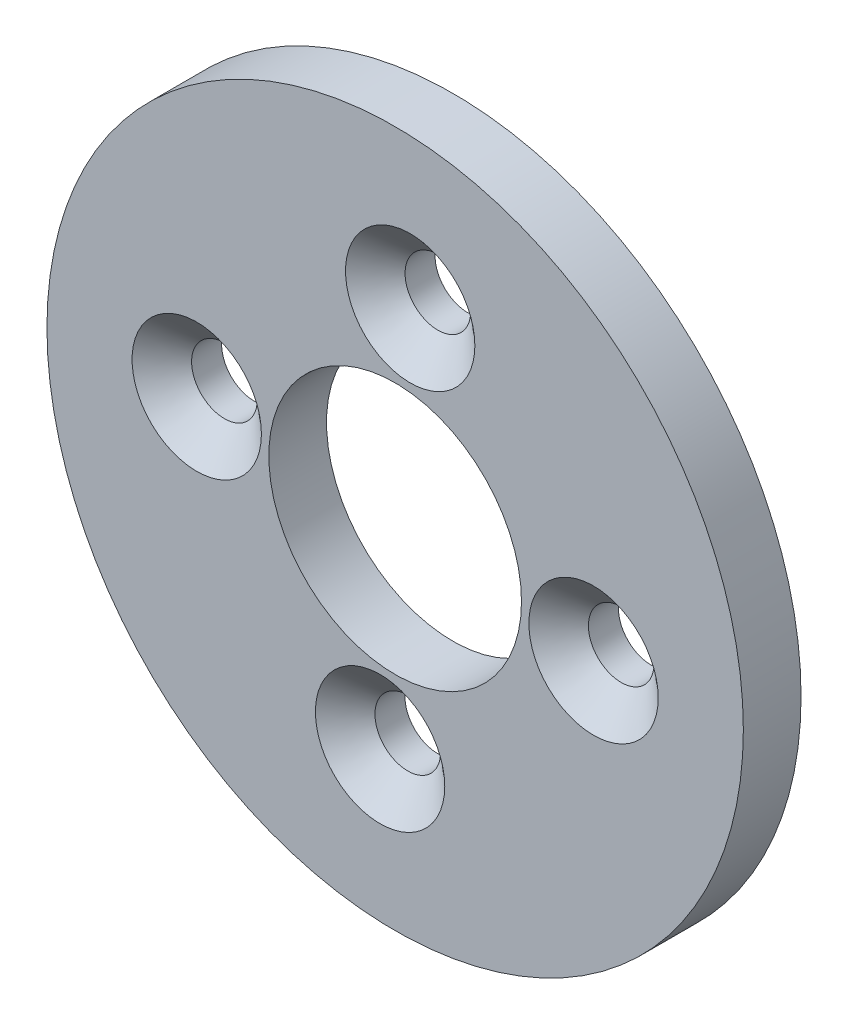
ISO-10303-21;
HEADER;
FILE_DESCRIPTION(('STEP AP214'),'2;1');
FILE_NAME('part.step','',(''),(''),'','','');
FILE_SCHEMA(('AUTOMOTIVE_DESIGN { 1 0 10303 214 1 1 1 1 }'));
ENDSEC;
DATA;
#1=APPLICATION_CONTEXT('core data for automotive mechanical design processes');
#2=APPLICATION_PROTOCOL_DEFINITION('international standard','automotive_design',2000,#1);
#3=PRODUCT_CONTEXT('',#1,'mechanical');
#4=PRODUCT('Part','Part','',(#3));
#5=PRODUCT_RELATED_PRODUCT_CATEGORY('part','',(#4));
#6=PRODUCT_DEFINITION_FORMATION('','',#4);
#7=PRODUCT_DEFINITION_CONTEXT('part definition',#1,'design');
#8=PRODUCT_DEFINITION('design','',#6,#7);
#9=PRODUCT_DEFINITION_SHAPE('','',#8);
#10=(LENGTH_UNIT() NAMED_UNIT(*) SI_UNIT(.MILLI.,.METRE.));
#11=(NAMED_UNIT(*) PLANE_ANGLE_UNIT() SI_UNIT($,.RADIAN.));
#12=(NAMED_UNIT(*) SI_UNIT($,.STERADIAN.) SOLID_ANGLE_UNIT());
#13=UNCERTAINTY_MEASURE_WITH_UNIT(LENGTH_MEASURE(1.E-05),#10,'distance_accuracy_value','');
#14=(GEOMETRIC_REPRESENTATION_CONTEXT(3) GLOBAL_UNCERTAINTY_ASSIGNED_CONTEXT((#13)) GLOBAL_UNIT_ASSIGNED_CONTEXT((#10,
#11,#12)) REPRESENTATION_CONTEXT('',''));
#15=CARTESIAN_POINT('',(0.,0.,0.));
#16=DIRECTION('',(0.,0.,1.));
#17=DIRECTION('',(1.,0.,0.));
#18=AXIS2_PLACEMENT_3D('',#15,#16,#17);
#19=CARTESIAN_POINT('',(0.,0.,2.9));
#20=DIRECTION('',(0.,0.,-1.));
#21=DIRECTION('',(-1.,0.,0.));
#22=AXIS2_PLACEMENT_3D('',#19,#20,#21);
#23=CYLINDRICAL_SURFACE('',#22,17.5);
#24=CARTESIAN_POINT('',(0.,0.,2.9));
#25=DIRECTION('',(0.,0.,1.));
#26=DIRECTION('',(1.,0.,0.));
#27=AXIS2_PLACEMENT_3D('',#24,#25,#26);
#28=CIRCLE('',#27,17.5);
#29=CARTESIAN_POINT('',(17.5,0.,2.9));
#30=VERTEX_POINT('',#29);
#31=EDGE_CURVE('E63',#30,#30,#28,.T.);
#32=ORIENTED_EDGE('',*,*,#31,.F.);
#33=EDGE_LOOP('',(#32));
#34=FACE_BOUND('',#33,.T.);
#35=CARTESIAN_POINT('',(0.,0.,0.));
#36=DIRECTION('',(0.,0.,1.));
#37=DIRECTION('',(1.,0.,0.));
#38=AXIS2_PLACEMENT_3D('',#35,#36,#37);
#39=CIRCLE('',#38,17.5);
#40=CARTESIAN_POINT('',(17.5,0.,0.));
#41=VERTEX_POINT('',#40);
#42=EDGE_CURVE('E64',#41,#41,#39,.T.);
#43=ORIENTED_EDGE('',*,*,#42,.T.);
#44=EDGE_LOOP('',(#43));
#45=FACE_BOUND('',#44,.T.);
#46=ADVANCED_FACE('F31',(#34,#45),#23,.T.);
#47=CARTESIAN_POINT('',(0.,0.,2.9));
#48=DIRECTION('',(0.,0.,1.));
#49=DIRECTION('',(1.,0.,0.));
#50=AXIS2_PLACEMENT_3D('',#47,#48,#49);
#51=PLANE('',#50);
#52=CARTESIAN_POINT('',(0.,0.,2.9));
#53=DIRECTION('',(0.,0.,1.));
#54=DIRECTION('',(1.,0.,0.));
#55=AXIS2_PLACEMENT_3D('',#52,#53,#54);
#56=CIRCLE('',#55,6.35000000000001);
#57=CARTESIAN_POINT('',(6.35,0.,2.9));
#58=VERTEX_POINT('',#57);
#59=EDGE_CURVE('E82',#58,#58,#56,.T.);
#60=ORIENTED_EDGE('',*,*,#59,.F.);
#61=EDGE_LOOP('',(#60));
#62=FACE_BOUND('',#61,.T.);
#63=CARTESIAN_POINT('',(-0.756588791368908,-9.97133759336104,2.9));
#64=DIRECTION('',(0.,0.,1.));
#65=DIRECTION('',(1.,0.,0.));
#66=AXIS2_PLACEMENT_3D('',#63,#64,#65);
#67=CIRCLE('',#66,3.25000000000009);
#68=CARTESIAN_POINT('',(2.49341120863118,-9.97133759336104,2.9));
#69=VERTEX_POINT('',#68);
#70=EDGE_CURVE('E46',#69,#69,#67,.F.);
#71=ORIENTED_EDGE('',*,*,#70,.T.);
#72=EDGE_LOOP('',(#71));
#73=FACE_BOUND('',#72,.T.);
#74=CARTESIAN_POINT('',(-9.97133759336103,0.75658879136889,2.9));
#75=DIRECTION('',(0.,0.,1.));
#76=DIRECTION('',(1.,0.,0.));
#77=AXIS2_PLACEMENT_3D('',#74,#75,#76);
#78=CIRCLE('',#77,3.2500000000001);
#79=CARTESIAN_POINT('',(-6.72133759336093,0.75658879136889,2.9));
#80=VERTEX_POINT('',#79);
#81=EDGE_CURVE('E51',#80,#80,#78,.F.);
#82=ORIENTED_EDGE('',*,*,#81,.T.);
#83=EDGE_LOOP('',(#82));
#84=FACE_BOUND('',#83,.T.);
#85=CARTESIAN_POINT('',(0.756588791368902,9.97133759336102,2.9));
#86=DIRECTION('',(0.,0.,1.));
#87=DIRECTION('',(1.,0.,0.));
#88=AXIS2_PLACEMENT_3D('',#85,#86,#87);
#89=CIRCLE('',#88,3.2500000000001);
#90=CARTESIAN_POINT('',(4.006588791369,9.97133759336102,2.9));
#91=VERTEX_POINT('',#90);
#92=EDGE_CURVE('E54',#91,#91,#89,.F.);
#93=ORIENTED_EDGE('',*,*,#92,.T.);
#94=EDGE_LOOP('',(#93));
#95=FACE_BOUND('',#94,.T.);
#96=CARTESIAN_POINT('',(9.97133759336103,-0.756588791368919,2.9));
#97=DIRECTION('',(0.,0.,1.));
#98=DIRECTION('',(1.,0.,0.));
#99=AXIS2_PLACEMENT_3D('',#96,#97,#98);
#100=CIRCLE('',#99,3.2500000000001);
#101=CARTESIAN_POINT('',(13.2213375933611,-0.756588791368919,2.9));
#102=VERTEX_POINT('',#101);
#103=EDGE_CURVE('E57',#102,#102,#100,.F.);
#104=ORIENTED_EDGE('',*,*,#103,.T.);
#105=EDGE_LOOP('',(#104));
#106=FACE_BOUND('',#105,.T.);
#107=ORIENTED_EDGE('',*,*,#31,.T.);
#108=EDGE_LOOP('',(#107));
#109=FACE_BOUND('',#108,.T.);
#110=ADVANCED_FACE('F97',(#62,#73,#84,#95,#106,#109),#51,.T.);
#111=CARTESIAN_POINT('',(0.,0.,0.));
#112=DIRECTION('',(0.,0.,1.));
#113=DIRECTION('',(1.,0.,0.));
#114=AXIS2_PLACEMENT_3D('',#111,#112,#113);
#115=PLANE('',#114);
#116=CARTESIAN_POINT('',(0.,0.,0.));
#117=DIRECTION('',(0.,0.,1.));
#118=DIRECTION('',(1.,0.,0.));
#119=AXIS2_PLACEMENT_3D('',#116,#117,#118);
#120=CIRCLE('',#119,6.35000000000001);
#121=CARTESIAN_POINT('',(6.35,0.,0.));
#122=VERTEX_POINT('',#121);
#123=EDGE_CURVE('E77',#122,#122,#120,.T.);
#124=ORIENTED_EDGE('',*,*,#123,.T.);
#125=EDGE_LOOP('',(#124));
#126=FACE_BOUND('',#125,.T.);
#127=CARTESIAN_POINT('',(-0.756588791368908,-9.97133759336104,0.));
#128=DIRECTION('',(0.,0.,1.));
#129=DIRECTION('',(1.,0.,0.));
#130=AXIS2_PLACEMENT_3D('',#127,#128,#129);
#131=CIRCLE('',#130,1.65000000000009);
#132=CARTESIAN_POINT('',(0.89341120863118,-9.97133759336104,0.));
#133=VERTEX_POINT('',#132);
#134=EDGE_CURVE('E72',#133,#133,#131,.T.);
#135=ORIENTED_EDGE('',*,*,#134,.T.);
#136=EDGE_LOOP('',(#135));
#137=FACE_BOUND('',#136,.T.);
#138=CARTESIAN_POINT('',(9.97133759336103,-0.756588791368919,0.));
#139=DIRECTION('',(0.,0.,1.));
#140=DIRECTION('',(1.,0.,0.));
#141=AXIS2_PLACEMENT_3D('',#138,#139,#140);
#142=CIRCLE('',#141,1.65000000000009);
#143=CARTESIAN_POINT('',(11.6213375933611,-0.756588791368919,0.));
#144=VERTEX_POINT('',#143);
#145=EDGE_CURVE('E76',#144,#144,#142,.T.);
#146=ORIENTED_EDGE('',*,*,#145,.T.);
#147=EDGE_LOOP('',(#146));
#148=FACE_BOUND('',#147,.T.);
#149=CARTESIAN_POINT('',(0.756588791368902,9.97133759336102,0.));
#150=DIRECTION('',(0.,0.,1.));
#151=DIRECTION('',(1.,0.,0.));
#152=AXIS2_PLACEMENT_3D('',#149,#150,#151);
#153=CIRCLE('',#152,1.65000000000009);
#154=CARTESIAN_POINT('',(2.40658879136899,9.97133759336102,0.));
#155=VERTEX_POINT('',#154);
#156=EDGE_CURVE('E73',#155,#155,#153,.T.);
#157=ORIENTED_EDGE('',*,*,#156,.T.);
#158=EDGE_LOOP('',(#157));
#159=FACE_BOUND('',#158,.T.);
#160=CARTESIAN_POINT('',(-9.97133759336103,0.75658879136889,0.));
#161=DIRECTION('',(0.,0.,1.));
#162=DIRECTION('',(1.,0.,0.));
#163=AXIS2_PLACEMENT_3D('',#160,#161,#162);
#164=CIRCLE('',#163,1.65000000000009);
#165=CARTESIAN_POINT('',(-8.32133759336095,0.75658879136889,0.));
#166=VERTEX_POINT('',#165);
#167=EDGE_CURVE('E67',#166,#166,#164,.T.);
#168=ORIENTED_EDGE('',*,*,#167,.T.);
#169=EDGE_LOOP('',(#168));
#170=FACE_BOUND('',#169,.T.);
#171=ORIENTED_EDGE('',*,*,#42,.F.);
#172=EDGE_LOOP('',(#171));
#173=FACE_BOUND('',#172,.T.);
#174=ADVANCED_FACE('F88',(#126,#137,#148,#159,#170,#173),#115,.F.);
#175=CARTESIAN_POINT('',(-9.97133759336103,0.75658879136889,0.));
#176=DIRECTION('',(0.,0.,1.));
#177=DIRECTION('',(1.,0.,0.));
#178=AXIS2_PLACEMENT_3D('',#175,#176,#177);
#179=CYLINDRICAL_SURFACE('',#178,1.65000000000009);
#180=CARTESIAN_POINT('',(-9.97133759336103,0.75658879136889,1.50914121949403));
#181=DIRECTION('',(0.,0.,1.));
#182=DIRECTION('',(1.,0.,0.));
#183=AXIS2_PLACEMENT_3D('',#180,#181,#182);
#184=CIRCLE('',#183,1.65000000000009);
#185=CARTESIAN_POINT('',(-8.32133759336095,0.75658879136889,1.50914121949403));
#186=VERTEX_POINT('',#185);
#187=EDGE_CURVE('E42',#186,#186,#184,.T.);
#188=ORIENTED_EDGE('',*,*,#187,.T.);
#189=EDGE_LOOP('',(#188));
#190=FACE_BOUND('',#189,.T.);
#191=ORIENTED_EDGE('',*,*,#167,.F.);
#192=EDGE_LOOP('',(#191));
#193=FACE_BOUND('',#192,.T.);
#194=ADVANCED_FACE('F117',(#190,#193),#179,.F.);
#195=CARTESIAN_POINT('',(0.756588791368902,9.97133759336102,0.));
#196=DIRECTION('',(0.,0.,1.));
#197=DIRECTION('',(1.,0.,0.));
#198=AXIS2_PLACEMENT_3D('',#195,#196,#197);
#199=CYLINDRICAL_SURFACE('',#198,1.65000000000009);
#200=CARTESIAN_POINT('',(0.756588791368902,9.97133759336102,1.50914121949403));
#201=DIRECTION('',(0.,0.,1.));
#202=DIRECTION('',(1.,0.,0.));
#203=AXIS2_PLACEMENT_3D('',#200,#201,#202);
#204=CIRCLE('',#203,1.65000000000009);
#205=CARTESIAN_POINT('',(2.40658879136899,9.97133759336102,1.50914121949403));
#206=VERTEX_POINT('',#205);
#207=EDGE_CURVE('E38',#206,#206,#204,.T.);
#208=ORIENTED_EDGE('',*,*,#207,.T.);
#209=EDGE_LOOP('',(#208));
#210=FACE_BOUND('',#209,.T.);
#211=ORIENTED_EDGE('',*,*,#156,.F.);
#212=EDGE_LOOP('',(#211));
#213=FACE_BOUND('',#212,.T.);
#214=ADVANCED_FACE('F122',(#210,#213),#199,.F.);
#215=CARTESIAN_POINT('',(9.97133759336103,-0.756588791368919,0.));
#216=DIRECTION('',(0.,0.,1.));
#217=DIRECTION('',(1.,0.,0.));
#218=AXIS2_PLACEMENT_3D('',#215,#216,#217);
#219=CYLINDRICAL_SURFACE('',#218,1.65000000000009);
#220=CARTESIAN_POINT('',(9.97133759336103,-0.756588791368919,1.50914121949403));
#221=DIRECTION('',(0.,0.,1.));
#222=DIRECTION('',(1.,0.,0.));
#223=AXIS2_PLACEMENT_3D('',#220,#221,#222);
#224=CIRCLE('',#223,1.65000000000009);
#225=CARTESIAN_POINT('',(11.6213375933611,-0.756588791368919,1.50914121949403));
#226=VERTEX_POINT('',#225);
#227=EDGE_CURVE('E10',#226,#226,#224,.T.);
#228=ORIENTED_EDGE('',*,*,#227,.T.);
#229=EDGE_LOOP('',(#228));
#230=FACE_BOUND('',#229,.T.);
#231=ORIENTED_EDGE('',*,*,#145,.F.);
#232=EDGE_LOOP('',(#231));
#233=FACE_BOUND('',#232,.T.);
#234=ADVANCED_FACE('F180',(#230,#233),#219,.F.);
#235=CARTESIAN_POINT('',(-0.756588791368908,-9.97133759336104,0.));
#236=DIRECTION('',(0.,0.,1.));
#237=DIRECTION('',(1.,0.,0.));
#238=AXIS2_PLACEMENT_3D('',#235,#236,#237);
#239=CYLINDRICAL_SURFACE('',#238,1.65000000000009);
#240=CARTESIAN_POINT('',(-0.756588791368908,-9.97133759336104,1.50914121949404));
#241=DIRECTION('',(0.,0.,1.));
#242=DIRECTION('',(1.,0.,0.));
#243=AXIS2_PLACEMENT_3D('',#240,#241,#242);
#244=CIRCLE('',#243,1.65000000000009);
#245=CARTESIAN_POINT('',(0.89341120863118,-9.97133759336104,1.50914121949404));
#246=VERTEX_POINT('',#245);
#247=EDGE_CURVE('E60',#246,#246,#244,.T.);
#248=ORIENTED_EDGE('',*,*,#247,.T.);
#249=EDGE_LOOP('',(#248));
#250=FACE_BOUND('',#249,.T.);
#251=ORIENTED_EDGE('',*,*,#134,.F.);
#252=EDGE_LOOP('',(#251));
#253=FACE_BOUND('',#252,.T.);
#254=ADVANCED_FACE('F130',(#250,#253),#239,.F.);
#255=CARTESIAN_POINT('',(-0.756588791368908,-9.97133759336104,1.50914121949404));
#256=DIRECTION('',(0.,0.,1.));
#257=DIRECTION('',(1.,0.,0.));
#258=AXIS2_PLACEMENT_3D('',#255,#256,#257);
#259=CONICAL_SURFACE('',#258,1.65000000000009,0.855211333477222);
#260=ORIENTED_EDGE('',*,*,#70,.F.);
#261=EDGE_LOOP('',(#260));
#262=FACE_BOUND('',#261,.T.);
#263=ORIENTED_EDGE('',*,*,#247,.F.);
#264=EDGE_LOOP('',(#263));
#265=FACE_BOUND('',#264,.T.);
#266=ADVANCED_FACE('F126',(#262,#265),#259,.F.);
#267=CARTESIAN_POINT('',(-9.97133759336103,0.75658879136889,1.50914121949403));
#268=DIRECTION('',(0.,0.,1.));
#269=DIRECTION('',(1.,0.,0.));
#270=AXIS2_PLACEMENT_3D('',#267,#268,#269);
#271=CONICAL_SURFACE('',#270,1.65000000000009,0.855211333477224);
#272=ORIENTED_EDGE('',*,*,#81,.F.);
#273=EDGE_LOOP('',(#272));
#274=FACE_BOUND('',#273,.T.);
#275=ORIENTED_EDGE('',*,*,#187,.F.);
#276=EDGE_LOOP('',(#275));
#277=FACE_BOUND('',#276,.T.);
#278=ADVANCED_FACE('F129',(#274,#277),#271,.F.);
#279=CARTESIAN_POINT('',(0.756588791368902,9.97133759336102,1.50914121949403));
#280=DIRECTION('',(0.,0.,1.));
#281=DIRECTION('',(1.,0.,0.));
#282=AXIS2_PLACEMENT_3D('',#279,#280,#281);
#283=CONICAL_SURFACE('',#282,1.65000000000009,0.855211333477224);
#284=ORIENTED_EDGE('',*,*,#92,.F.);
#285=EDGE_LOOP('',(#284));
#286=FACE_BOUND('',#285,.T.);
#287=ORIENTED_EDGE('',*,*,#207,.F.);
#288=EDGE_LOOP('',(#287));
#289=FACE_BOUND('',#288,.T.);
#290=ADVANCED_FACE('F133',(#286,#289),#283,.F.);
#291=CARTESIAN_POINT('',(9.97133759336103,-0.756588791368919,1.50914121949403));
#292=DIRECTION('',(0.,0.,1.));
#293=DIRECTION('',(1.,0.,0.));
#294=AXIS2_PLACEMENT_3D('',#291,#292,#293);
#295=CONICAL_SURFACE('',#294,1.65000000000009,0.855211333477224);
#296=ORIENTED_EDGE('',*,*,#103,.F.);
#297=EDGE_LOOP('',(#296));
#298=FACE_BOUND('',#297,.T.);
#299=ORIENTED_EDGE('',*,*,#227,.F.);
#300=EDGE_LOOP('',(#299));
#301=FACE_BOUND('',#300,.T.);
#302=ADVANCED_FACE('F33',(#298,#301),#295,.F.);
#303=CARTESIAN_POINT('',(0.,0.,0.));
#304=DIRECTION('',(0.,0.,1.));
#305=DIRECTION('',(1.,0.,0.));
#306=AXIS2_PLACEMENT_3D('',#303,#304,#305);
#307=CYLINDRICAL_SURFACE('',#306,6.35000000000001);
#308=ORIENTED_EDGE('',*,*,#123,.F.);
#309=EDGE_LOOP('',(#308));
#310=FACE_BOUND('',#309,.T.);
#311=ORIENTED_EDGE('',*,*,#59,.T.);
#312=EDGE_LOOP('',(#311));
#313=FACE_BOUND('',#312,.T.);
#314=ADVANCED_FACE('F91',(#310,#313),#307,.F.);
#315=CLOSED_SHELL('',(#46,#110,#174,#194,#214,#234,#254,#266,#278,#290,#302,#314));
#316=MANIFOLD_SOLID_BREP('B2',#315);
#317=ADVANCED_BREP_SHAPE_REPRESENTATION('',(#18,#316),#14);
#318=SHAPE_DEFINITION_REPRESENTATION(#9,#317);
ENDSEC;
END-ISO-10303-21;
